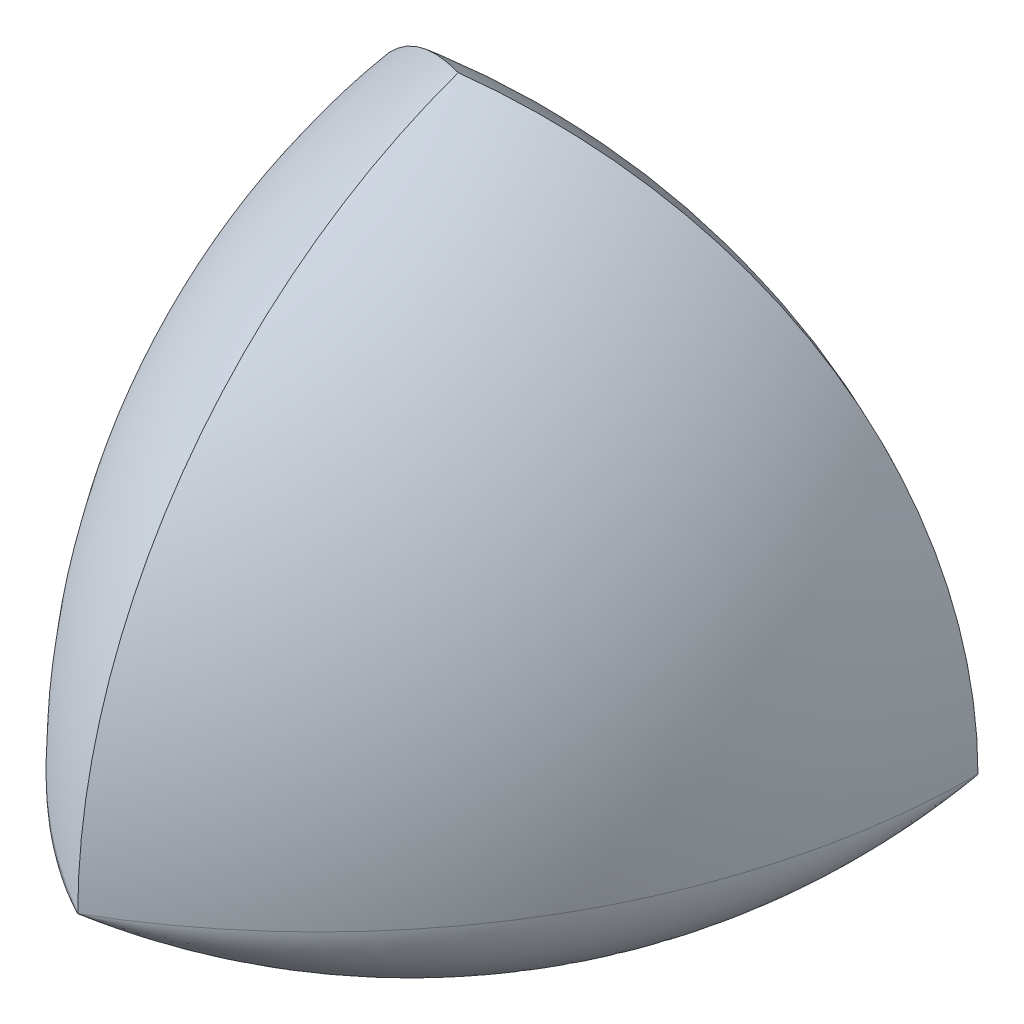
ISO-10303-21;
HEADER;
FILE_DESCRIPTION(('STEP AP214'),'2;1');
FILE_NAME('part.step','',(''),(''),'','','');
FILE_SCHEMA(('AUTOMOTIVE_DESIGN { 1 0 10303 214 1 1 1 1 }'));
ENDSEC;
DATA;
#1=APPLICATION_CONTEXT('core data for automotive mechanical design processes');
#2=APPLICATION_PROTOCOL_DEFINITION('international standard','automotive_design',2000,#1);
#3=PRODUCT_CONTEXT('',#1,'mechanical');
#4=PRODUCT('Part','Part','',(#3));
#5=PRODUCT_RELATED_PRODUCT_CATEGORY('part','',(#4));
#6=PRODUCT_DEFINITION_FORMATION('','',#4);
#7=PRODUCT_DEFINITION_CONTEXT('part definition',#1,'design');
#8=PRODUCT_DEFINITION('design','',#6,#7);
#9=PRODUCT_DEFINITION_SHAPE('','',#8);
#10=(LENGTH_UNIT() NAMED_UNIT(*) SI_UNIT(.MILLI.,.METRE.));
#11=(NAMED_UNIT(*) PLANE_ANGLE_UNIT() SI_UNIT($,.RADIAN.));
#12=(NAMED_UNIT(*) SI_UNIT($,.STERADIAN.) SOLID_ANGLE_UNIT());
#13=UNCERTAINTY_MEASURE_WITH_UNIT(LENGTH_MEASURE(1.E-05),#10,'distance_accuracy_value','');
#14=(GEOMETRIC_REPRESENTATION_CONTEXT(3) GLOBAL_UNCERTAINTY_ASSIGNED_CONTEXT((#13)) GLOBAL_UNIT_ASSIGNED_CONTEXT((#10,
#11,#12)) REPRESENTATION_CONTEXT('',''));
#15=CARTESIAN_POINT('',(0.,0.,0.));
#16=DIRECTION('',(0.,0.,1.));
#17=DIRECTION('',(1.,0.,0.));
#18=AXIS2_PLACEMENT_3D('',#15,#16,#17);
#19=CARTESIAN_POINT('',(3.72447072886934E-05,15.3462214265126,-0.000170093584883889));
#20=DIRECTION('',(-1.,0.,0.));
#21=DIRECTION('',(0.,1.,0.));
#22=AXIS2_PLACEMENT_3D('',#19,#20,#21);
#23=SPHERICAL_SURFACE('',#22,25.);
#24=CARTESIAN_POINT('',(3.72447072941819E-05,15.3462214265126,-0.00017009358488072));
#25=DIRECTION('',(0.816496580927724,0.333333333333333,0.471404520791036));
#26=DIRECTION('',(0.500000000000004,0.,-0.866025403784436));
#27=AXIS2_PLACEMENT_3D('',#24,#25,#26);
#28=CIRCLE('',#27,25.);
#29=CARTESIAN_POINT('',(12.5000372447073,-5.06619309668059,-7.21704845845515));
#30=VERTEX_POINT('',#29);
#31=CARTESIAN_POINT('',(3.72447071594565E-05,-5.0661930966806,14.4335866361558));
#32=VERTEX_POINT('',#31);
#33=EDGE_CURVE('E72',#30,#32,#28,.F.);
#34=ORIENTED_EDGE('',*,*,#33,.T.);
#35=CARTESIAN_POINT('',(3.72447072805491E-05,15.3462214265126,-0.000170093584879187));
#36=DIRECTION('',(-0.816496580927731,0.333333333333333,0.471404520791024));
#37=DIRECTION('',(0.499999999999992,0.,0.866025403784443));
#38=AXIS2_PLACEMENT_3D('',#35,#36,#37);
#39=CIRCLE('',#38,25.);
#40=CARTESIAN_POINT('',(-12.4999627552926,-5.0661930966806,-7.21704845845532));
#41=VERTEX_POINT('',#40);
#42=EDGE_CURVE('E65',#32,#41,#39,.F.);
#43=ORIENTED_EDGE('',*,*,#42,.T.);
#44=CARTESIAN_POINT('',(3.72447072886934E-05,15.3462214265126,-0.000170093584888795));
#45=DIRECTION('',(0.,0.333333333333333,-0.942809041582063));
#46=DIRECTION('',(0.,0.942809041582063,0.333333333333333));
#47=AXIS2_PLACEMENT_3D('',#44,#45,#46);
#48=CIRCLE('',#47,25.);
#49=EDGE_CURVE('E81',#41,#30,#48,.F.);
#50=ORIENTED_EDGE('',*,*,#49,.T.);
#51=EDGE_LOOP('',(#34,#43,#50));
#52=FACE_BOUND('',#51,.T.);
#53=ADVANCED_FACE('F41',(#52),#23,.T.);
#54=CARTESIAN_POINT('',(12.5000372447073,-5.0661930966806,-7.21704845845521));
#55=DIRECTION('',(-1.,0.,0.));
#56=DIRECTION('',(0.,1.,0.));
#57=AXIS2_PLACEMENT_3D('',#54,#55,#56);
#58=SPHERICAL_SURFACE('',#57,25.);
#59=CARTESIAN_POINT('',(12.5000372447073,-5.06619309668062,-7.21704845845521));
#60=DIRECTION('',(0.,-1.,0.));
#61=DIRECTION('',(1.,0.,0.));
#62=AXIS2_PLACEMENT_3D('',#59,#60,#61);
#63=CIRCLE('',#62,25.);
#64=EDGE_CURVE('E59',#32,#41,#63,.T.);
#65=ORIENTED_EDGE('',*,*,#64,.F.);
#66=CARTESIAN_POINT('',(3.72447072852239E-05,-5.0661930966806,-7.21704845845521));
#67=DIRECTION('',(-1.,0.,0.));
#68=DIRECTION('',(0.,0.,1.));
#69=AXIS2_PLACEMENT_3D('',#66,#67,#68);
#70=CIRCLE('',#69,21.650635094611);
#71=CARTESIAN_POINT('',(3.72447072858346E-05,15.3462214265126,-0.000170093584882027));
#72=VERTEX_POINT('',#71);
#73=EDGE_CURVE('E11',#72,#32,#70,.F.);
#74=ORIENTED_EDGE('',*,*,#73,.F.);
#75=CARTESIAN_POINT('',(6.25003724470729,-5.0661930966806,3.60826908885028));
#76=DIRECTION('',(0.5,0.,-0.866025403784439));
#77=DIRECTION('',(-0.866025403784439,0.,-0.5));
#78=AXIS2_PLACEMENT_3D('',#75,#76,#77);
#79=CIRCLE('',#78,21.650635094611);
#80=EDGE_CURVE('E48',#41,#72,#79,.T.);
#81=ORIENTED_EDGE('',*,*,#80,.F.);
#82=EDGE_LOOP('',(#65,#74,#81));
#83=FACE_BOUND('',#82,.T.);
#84=ADVANCED_FACE('F85',(#83),#58,.T.);
#85=CARTESIAN_POINT('',(-12.4999627552927,-5.0661930966806,-7.21704845845521));
#86=DIRECTION('',(1.,0.,0.));
#87=DIRECTION('',(0.,-1.,0.));
#88=AXIS2_PLACEMENT_3D('',#85,#86,#87);
#89=SPHERICAL_SURFACE('',#88,25.);
#90=ORIENTED_EDGE('',*,*,#73,.T.);
#91=CARTESIAN_POINT('',(-12.4999627552927,-5.06619309668062,-7.21704845845521));
#92=DIRECTION('',(0.,-1.,0.));
#93=DIRECTION('',(1.,0.,0.));
#94=AXIS2_PLACEMENT_3D('',#91,#92,#93);
#95=CIRCLE('',#94,25.);
#96=EDGE_CURVE('E76',#32,#30,#95,.F.);
#97=ORIENTED_EDGE('',*,*,#96,.T.);
#98=CARTESIAN_POINT('',(-6.24996275529271,-5.0661930966806,3.60826908885028));
#99=DIRECTION('',(-0.5,0.,-0.866025403784439));
#100=DIRECTION('',(-0.866025403784439,0.,0.5));
#101=AXIS2_PLACEMENT_3D('',#98,#99,#100);
#102=CIRCLE('',#101,21.650635094611);
#103=EDGE_CURVE('E88',#30,#72,#102,.F.);
#104=ORIENTED_EDGE('',*,*,#103,.T.);
#105=EDGE_LOOP('',(#90,#97,#104));
#106=FACE_BOUND('',#105,.T.);
#107=ADVANCED_FACE('F87',(#106),#89,.T.);
#108=CARTESIAN_POINT('',(3.72447072886417E-05,-5.0661930966806,14.4335866361558));
#109=DIRECTION('',(-1.,0.,0.));
#110=DIRECTION('',(0.,1.,0.));
#111=AXIS2_PLACEMENT_3D('',#108,#109,#110);
#112=SPHERICAL_SURFACE('',#111,25.);
#113=CARTESIAN_POINT('',(3.72447072886417E-05,-5.06619309668062,14.4335866361558));
#114=DIRECTION('',(0.,-1.,0.));
#115=DIRECTION('',(0.,0.,-1.));
#116=AXIS2_PLACEMENT_3D('',#113,#114,#115);
#117=CIRCLE('',#116,25.);
#118=EDGE_CURVE('E91',#41,#30,#117,.T.);
#119=ORIENTED_EDGE('',*,*,#118,.F.);
#120=ORIENTED_EDGE('',*,*,#80,.T.);
#121=ORIENTED_EDGE('',*,*,#103,.F.);
#122=EDGE_LOOP('',(#119,#120,#121));
#123=FACE_BOUND('',#122,.T.);
#124=ADVANCED_FACE('F97',(#123),#112,.T.);
#125=CARTESIAN_POINT('',(3.72447072886417E-05,-5.0661930966806,-28.8676835530662));
#126=DIRECTION('',(0.,-1.,0.));
#127=DIRECTION('',(0.,0.,1.));
#128=AXIS2_PLACEMENT_3D('',#125,#126,#127);
#129=CIRCLE('',#128,25.);
#130=TRIMMED_CURVE('',#129,(PARAMETER_VALUE(-0.523598775598299)),
(PARAMETER_VALUE(0.523598775598299)),.T.,.PARAMETER.);
#131=CARTESIAN_POINT('',(3.72447072886417E-05,-5.0661930966806,-7.2170484584552));
#132=DIRECTION('',(-1.,0.,0.));
#133=AXIS1_PLACEMENT('',#131,#132);
#134=SURFACE_OF_REVOLUTION('',#130,#133);
#135=ORIENTED_EDGE('',*,*,#49,.F.);
#136=ORIENTED_EDGE('',*,*,#118,.T.);
#137=EDGE_LOOP('',(#135,#136));
#138=FACE_BOUND('',#137,.T.);
#139=ADVANCED_FACE('F96',(#138),#134,.T.);
#140=CARTESIAN_POINT('',(25.0000372447072,-5.0661930966806,14.4335866361559));
#141=DIRECTION('',(0.,-1.,0.));
#142=DIRECTION('',(-0.866025403784436,0.,-0.500000000000004));
#143=AXIS2_PLACEMENT_3D('',#140,#141,#142);
#144=CIRCLE('',#143,25.);
#145=TRIMMED_CURVE('',#144,(PARAMETER_VALUE(-0.523598775598299)),
(PARAMETER_VALUE(0.523598775598299)),.T.,.PARAMETER.);
#146=CARTESIAN_POINT('',(6.25003724470727,-5.0661930966806,3.6082690888503));
#147=DIRECTION('',(0.500000000000004,0.,-0.866025403784436));
#148=AXIS1_PLACEMENT('',#146,#147);
#149=SURFACE_OF_REVOLUTION('',#145,#148);
#150=ORIENTED_EDGE('',*,*,#33,.F.);
#151=ORIENTED_EDGE('',*,*,#96,.F.);
#152=EDGE_LOOP('',(#150,#151));
#153=FACE_BOUND('',#152,.T.);
#154=ADVANCED_FACE('F77',(#153),#149,.T.);
#155=CARTESIAN_POINT('',(-24.9999627552928,-5.06619309668061,14.4335866361555));
#156=DIRECTION('',(0.,-1.,0.));
#157=DIRECTION('',(0.866025403784443,0.,-0.499999999999992));
#158=AXIS2_PLACEMENT_3D('',#155,#156,#157);
#159=CIRCLE('',#158,25.);
#160=TRIMMED_CURVE('',#159,(PARAMETER_VALUE(-0.523598775598299)),
(PARAMETER_VALUE(0.523598775598299)),.T.,.PARAMETER.);
#161=CARTESIAN_POINT('',(-6.24996275529274,-5.0661930966806,3.60826908885022));
#162=DIRECTION('',(0.499999999999992,0.,0.866025403784443));
#163=AXIS1_PLACEMENT('',#161,#162);
#164=SURFACE_OF_REVOLUTION('',#160,#163);
#165=ORIENTED_EDGE('',*,*,#42,.F.);
#166=ORIENTED_EDGE('',*,*,#64,.T.);
#167=EDGE_LOOP('',(#165,#166));
#168=FACE_BOUND('',#167,.T.);
#169=ADVANCED_FACE('F67',(#168),#164,.T.);
#170=CLOSED_SHELL('',(#53,#84,#107,#124,#139,#154,#169));
#171=MANIFOLD_SOLID_BREP('B2',#170);
#172=ADVANCED_BREP_SHAPE_REPRESENTATION('',(#18,#171),#14);
#173=SHAPE_DEFINITION_REPRESENTATION(#9,#172);
ENDSEC;
END-ISO-10303-21;
